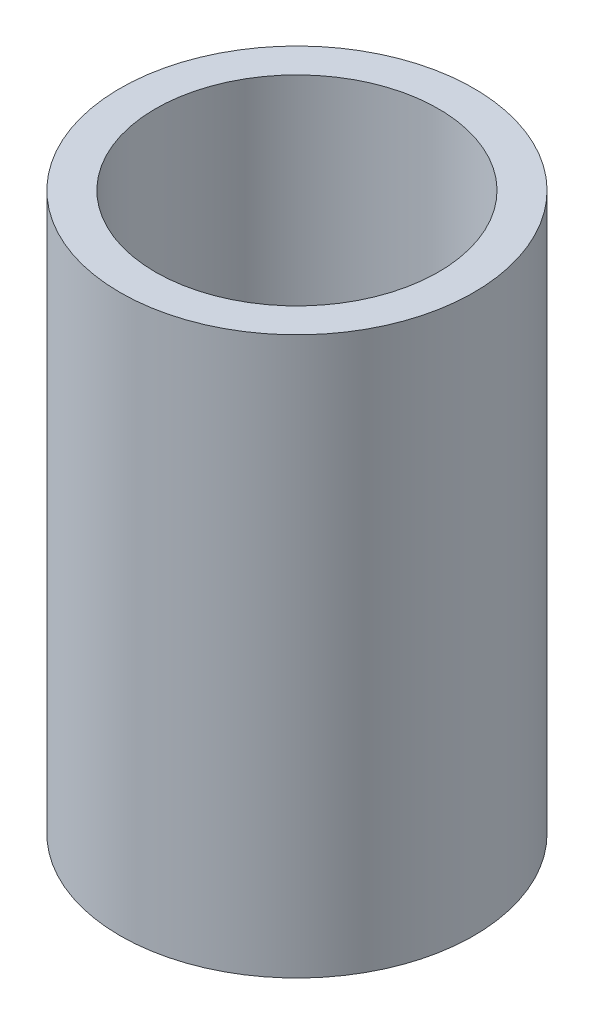
ISO-10303-21;
HEADER;
FILE_DESCRIPTION(('STEP AP214'),'2;1');
FILE_NAME('part.step','',(''),(''),'','','');
FILE_SCHEMA(('AUTOMOTIVE_DESIGN { 1 0 10303 214 1 1 1 1 }'));
ENDSEC;
DATA;
#1=APPLICATION_CONTEXT('core data for automotive mechanical design processes');
#2=APPLICATION_PROTOCOL_DEFINITION('international standard','automotive_design',2000,#1);
#3=PRODUCT_CONTEXT('',#1,'mechanical');
#4=PRODUCT('Part','Part','',(#3));
#5=PRODUCT_RELATED_PRODUCT_CATEGORY('part','',(#4));
#6=PRODUCT_DEFINITION_FORMATION('','',#4);
#7=PRODUCT_DEFINITION_CONTEXT('part definition',#1,'design');
#8=PRODUCT_DEFINITION('design','',#6,#7);
#9=PRODUCT_DEFINITION_SHAPE('','',#8);
#10=(LENGTH_UNIT() NAMED_UNIT(*) SI_UNIT(.MILLI.,.METRE.));
#11=(NAMED_UNIT(*) PLANE_ANGLE_UNIT() SI_UNIT($,.RADIAN.));
#12=(NAMED_UNIT(*) SI_UNIT($,.STERADIAN.) SOLID_ANGLE_UNIT());
#13=UNCERTAINTY_MEASURE_WITH_UNIT(LENGTH_MEASURE(1.E-05),#10,'distance_accuracy_value','');
#14=(GEOMETRIC_REPRESENTATION_CONTEXT(3) GLOBAL_UNCERTAINTY_ASSIGNED_CONTEXT((#13)) GLOBAL_UNIT_ASSIGNED_CONTEXT((#10,
#11,#12)) REPRESENTATION_CONTEXT('',''));
#15=CARTESIAN_POINT('',(0.,0.,0.));
#16=DIRECTION('',(0.,0.,1.));
#17=DIRECTION('',(1.,0.,0.));
#18=AXIS2_PLACEMENT_3D('',#15,#16,#17);
#19=CARTESIAN_POINT('',(0.,50.,0.));
#20=DIRECTION('',(0.,1.,0.));
#21=DIRECTION('',(0.,0.,1.));
#22=AXIS2_PLACEMENT_3D('',#19,#20,#21);
#23=PLANE('',#22);
#24=CARTESIAN_POINT('',(0.,50.,0.));
#25=DIRECTION('',(0.,1.,0.));
#26=DIRECTION('',(0.,0.,1.));
#27=AXIS2_PLACEMENT_3D('',#24,#25,#26);
#28=CIRCLE('',#27,15.875);
#29=CARTESIAN_POINT('',(0.,50.,15.875));
#30=VERTEX_POINT('',#29);
#31=EDGE_CURVE('E10',#30,#30,#28,.T.);
#32=ORIENTED_EDGE('',*,*,#31,.T.);
#33=EDGE_LOOP('',(#32));
#34=FACE_BOUND('',#33,.T.);
#35=CARTESIAN_POINT('',(0.,50.,0.));
#36=DIRECTION('',(0.,1.,0.));
#37=DIRECTION('',(0.,0.,1.));
#38=AXIS2_PLACEMENT_3D('',#35,#36,#37);
#39=CIRCLE('',#38,12.7);
#40=CARTESIAN_POINT('',(0.,50.,12.7));
#41=VERTEX_POINT('',#40);
#42=EDGE_CURVE('E52',#41,#41,#39,.T.);
#43=ORIENTED_EDGE('',*,*,#42,.F.);
#44=EDGE_LOOP('',(#43));
#45=FACE_BOUND('',#44,.T.);
#46=ADVANCED_FACE('F41',(#34,#45),#23,.T.);
#47=CARTESIAN_POINT('',(0.,0.,0.));
#48=DIRECTION('',(0.,1.,0.));
#49=DIRECTION('',(0.,0.,1.));
#50=AXIS2_PLACEMENT_3D('',#47,#48,#49);
#51=PLANE('',#50);
#52=CARTESIAN_POINT('',(0.,0.,0.));
#53=DIRECTION('',(0.,1.,0.));
#54=DIRECTION('',(0.,0.,1.));
#55=AXIS2_PLACEMENT_3D('',#52,#53,#54);
#56=CIRCLE('',#55,15.875);
#57=CARTESIAN_POINT('',(0.,0.,15.875));
#58=VERTEX_POINT('',#57);
#59=EDGE_CURVE('E45',#58,#58,#56,.T.);
#60=ORIENTED_EDGE('',*,*,#59,.F.);
#61=EDGE_LOOP('',(#60));
#62=FACE_BOUND('',#61,.T.);
#63=CARTESIAN_POINT('',(0.,0.,0.));
#64=DIRECTION('',(0.,1.,0.));
#65=DIRECTION('',(0.,0.,1.));
#66=AXIS2_PLACEMENT_3D('',#63,#64,#65);
#67=CIRCLE('',#66,12.7);
#68=CARTESIAN_POINT('',(0.,0.,12.7));
#69=VERTEX_POINT('',#68);
#70=EDGE_CURVE('E54',#69,#69,#67,.T.);
#71=ORIENTED_EDGE('',*,*,#70,.T.);
#72=EDGE_LOOP('',(#71));
#73=FACE_BOUND('',#72,.T.);
#74=ADVANCED_FACE('F64',(#62,#73),#51,.F.);
#75=CARTESIAN_POINT('',(0.,50.,0.));
#76=DIRECTION('',(0.,-1.,0.));
#77=DIRECTION('',(0.,0.,-1.));
#78=AXIS2_PLACEMENT_3D('',#75,#76,#77);
#79=CYLINDRICAL_SURFACE('',#78,15.875);
#80=ORIENTED_EDGE('',*,*,#31,.F.);
#81=EDGE_LOOP('',(#80));
#82=FACE_BOUND('',#81,.T.);
#83=ORIENTED_EDGE('',*,*,#59,.T.);
#84=EDGE_LOOP('',(#83));
#85=FACE_BOUND('',#84,.T.);
#86=ADVANCED_FACE('F43',(#82,#85),#79,.T.);
#87=CARTESIAN_POINT('',(0.,50.,0.));
#88=DIRECTION('',(0.,-1.,0.));
#89=DIRECTION('',(0.,0.,-1.));
#90=AXIS2_PLACEMENT_3D('',#87,#88,#89);
#91=CYLINDRICAL_SURFACE('',#90,12.7);
#92=ORIENTED_EDGE('',*,*,#42,.T.);
#93=EDGE_LOOP('',(#92));
#94=FACE_BOUND('',#93,.T.);
#95=ORIENTED_EDGE('',*,*,#70,.F.);
#96=EDGE_LOOP('',(#95));
#97=FACE_BOUND('',#96,.T.);
#98=ADVANCED_FACE('F60',(#94,#97),#91,.F.);
#99=CLOSED_SHELL('',(#46,#74,#86,#98));
#100=MANIFOLD_SOLID_BREP('B2',#99);
#101=ADVANCED_BREP_SHAPE_REPRESENTATION('',(#18,#100),#14);
#102=SHAPE_DEFINITION_REPRESENTATION(#9,#101);
ENDSEC;
END-ISO-10303-21;
